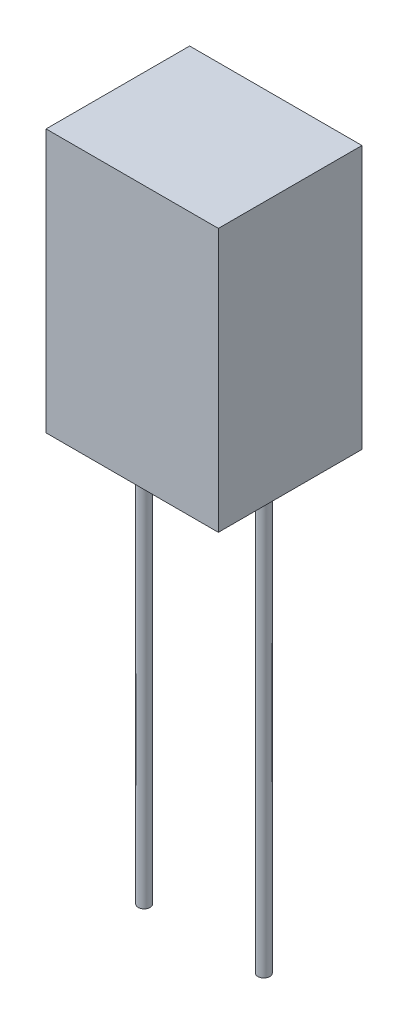
ISO-10303-21;
HEADER;
FILE_DESCRIPTION(('STEP AP214'),'2;1');
FILE_NAME('part.step','',(''),(''),'','','');
FILE_SCHEMA(('AUTOMOTIVE_DESIGN { 1 0 10303 214 1 1 1 1 }'));
ENDSEC;
DATA;
#1=APPLICATION_CONTEXT('core data for automotive mechanical design processes');
#2=APPLICATION_PROTOCOL_DEFINITION('international standard','automotive_design',2000,#1);
#3=PRODUCT_CONTEXT('',#1,'mechanical');
#4=PRODUCT('Part','Part','',(#3));
#5=PRODUCT_RELATED_PRODUCT_CATEGORY('part','',(#4));
#6=PRODUCT_DEFINITION_FORMATION('','',#4);
#7=PRODUCT_DEFINITION_CONTEXT('part definition',#1,'design');
#8=PRODUCT_DEFINITION('design','',#6,#7);
#9=PRODUCT_DEFINITION_SHAPE('','',#8);
#10=(LENGTH_UNIT() NAMED_UNIT(*) SI_UNIT(.MILLI.,.METRE.));
#11=(NAMED_UNIT(*) PLANE_ANGLE_UNIT() SI_UNIT($,.RADIAN.));
#12=(NAMED_UNIT(*) SI_UNIT($,.STERADIAN.) SOLID_ANGLE_UNIT());
#13=UNCERTAINTY_MEASURE_WITH_UNIT(LENGTH_MEASURE(1.E-05),#10,'distance_accuracy_value','');
#14=(GEOMETRIC_REPRESENTATION_CONTEXT(3) GLOBAL_UNCERTAINTY_ASSIGNED_CONTEXT((#13)) GLOBAL_UNIT_ASSIGNED_CONTEXT((#10,
#11,#12)) REPRESENTATION_CONTEXT('',''));
#15=CARTESIAN_POINT('',(0.,0.,0.));
#16=DIRECTION('',(0.,0.,1.));
#17=DIRECTION('',(1.,0.,0.));
#18=AXIS2_PLACEMENT_3D('',#15,#16,#17);
#19=CARTESIAN_POINT('',(3.6,5.5,6.));
#20=DIRECTION('',(-1.,0.,0.));
#21=DIRECTION('',(0.,-1.,0.));
#22=AXIS2_PLACEMENT_3D('',#19,#20,#21);
#23=PLANE('',#22);
#24=DIRECTION('',(0.,1.,0.));
#25=VECTOR('',#24,1.);
#26=CARTESIAN_POINT('',(3.6,5.5,0.));
#27=LINE('',#26,#25);
#28=CARTESIAN_POINT('',(3.6,-5.5,0.));
#29=VERTEX_POINT('',#28);
#30=CARTESIAN_POINT('',(3.6,5.5,0.));
#31=VERTEX_POINT('',#30);
#32=EDGE_CURVE('E104',#29,#31,#27,.T.);
#33=ORIENTED_EDGE('',*,*,#32,.T.);
#34=DIRECTION('',(0.,0.,-1.));
#35=VECTOR('',#34,1.);
#36=CARTESIAN_POINT('',(3.6,5.5,6.));
#37=LINE('',#36,#35);
#38=CARTESIAN_POINT('',(3.6,5.5,6.));
#39=VERTEX_POINT('',#38);
#40=EDGE_CURVE('E95',#39,#31,#37,.T.);
#41=ORIENTED_EDGE('',*,*,#40,.F.);
#42=DIRECTION('',(0.,1.,0.));
#43=VECTOR('',#42,1.);
#44=CARTESIAN_POINT('',(3.6,5.5,6.));
#45=LINE('',#44,#43);
#46=CARTESIAN_POINT('',(3.6,-5.5,6.));
#47=VERTEX_POINT('',#46);
#48=EDGE_CURVE('E89',#47,#39,#45,.T.);
#49=ORIENTED_EDGE('',*,*,#48,.F.);
#50=DIRECTION('',(0.,0.,-1.));
#51=VECTOR('',#50,1.);
#52=CARTESIAN_POINT('',(3.6,-5.5,6.));
#53=LINE('',#52,#51);
#54=EDGE_CURVE('E100',#47,#29,#53,.T.);
#55=ORIENTED_EDGE('',*,*,#54,.T.);
#56=EDGE_LOOP('',(#33,#41,#49,#55));
#57=FACE_BOUND('',#56,.T.);
#58=ADVANCED_FACE('F37',(#57),#23,.F.);
#59=CARTESIAN_POINT('',(-3.6,5.5,6.));
#60=DIRECTION('',(0.,-1.,0.));
#61=DIRECTION('',(0.,0.,-1.));
#62=AXIS2_PLACEMENT_3D('',#59,#60,#61);
#63=PLANE('',#62);
#64=DIRECTION('',(-1.,0.,0.));
#65=VECTOR('',#64,1.);
#66=CARTESIAN_POINT('',(-3.6,5.5,0.));
#67=LINE('',#66,#65);
#68=CARTESIAN_POINT('',(-3.6,5.5,0.));
#69=VERTEX_POINT('',#68);
#70=EDGE_CURVE('E94',#31,#69,#67,.T.);
#71=ORIENTED_EDGE('',*,*,#70,.T.);
#72=DIRECTION('',(0.,0.,-1.));
#73=VECTOR('',#72,1.);
#74=CARTESIAN_POINT('',(-3.6,5.5,6.));
#75=LINE('',#74,#73);
#76=CARTESIAN_POINT('',(-3.6,5.5,6.));
#77=VERTEX_POINT('',#76);
#78=EDGE_CURVE('E92',#77,#69,#75,.T.);
#79=ORIENTED_EDGE('',*,*,#78,.F.);
#80=DIRECTION('',(-1.,0.,0.));
#81=VECTOR('',#80,1.);
#82=CARTESIAN_POINT('',(-3.6,5.5,6.));
#83=LINE('',#82,#81);
#84=EDGE_CURVE('E84',#39,#77,#83,.T.);
#85=ORIENTED_EDGE('',*,*,#84,.F.);
#86=ORIENTED_EDGE('',*,*,#40,.T.);
#87=EDGE_LOOP('',(#71,#79,#85,#86));
#88=FACE_BOUND('',#87,.T.);
#89=ADVANCED_FACE('F93',(#88),#63,.F.);
#90=CARTESIAN_POINT('',(-3.6,5.5,6.));
#91=DIRECTION('',(1.,0.,0.));
#92=DIRECTION('',(0.,1.,0.));
#93=AXIS2_PLACEMENT_3D('',#90,#91,#92);
#94=PLANE('',#93);
#95=DIRECTION('',(0.,-1.,0.));
#96=VECTOR('',#95,1.);
#97=CARTESIAN_POINT('',(-3.6,5.5,0.));
#98=LINE('',#97,#96);
#99=CARTESIAN_POINT('',(-3.6,-5.5,0.));
#100=VERTEX_POINT('',#99);
#101=EDGE_CURVE('E70',#69,#100,#98,.T.);
#102=ORIENTED_EDGE('',*,*,#101,.T.);
#103=DIRECTION('',(0.,0.,-1.));
#104=VECTOR('',#103,1.);
#105=CARTESIAN_POINT('',(-3.6,-5.5,6.));
#106=LINE('',#105,#104);
#107=CARTESIAN_POINT('',(-3.6,-5.5,6.));
#108=VERTEX_POINT('',#107);
#109=EDGE_CURVE('E96',#108,#100,#106,.T.);
#110=ORIENTED_EDGE('',*,*,#109,.F.);
#111=DIRECTION('',(0.,-1.,0.));
#112=VECTOR('',#111,1.);
#113=CARTESIAN_POINT('',(-3.6,5.5,6.));
#114=LINE('',#113,#112);
#115=EDGE_CURVE('E87',#77,#108,#114,.T.);
#116=ORIENTED_EDGE('',*,*,#115,.F.);
#117=ORIENTED_EDGE('',*,*,#78,.T.);
#118=EDGE_LOOP('',(#102,#110,#116,#117));
#119=FACE_BOUND('',#118,.T.);
#120=ADVANCED_FACE('F98',(#119),#94,.F.);
#121=CARTESIAN_POINT('',(-3.6,-5.5,6.));
#122=DIRECTION('',(0.,1.,0.));
#123=DIRECTION('',(0.,0.,1.));
#124=AXIS2_PLACEMENT_3D('',#121,#122,#123);
#125=PLANE('',#124);
#126=CARTESIAN_POINT('',(2.5,-5.5,3.));
#127=DIRECTION('',(0.,1.,0.));
#128=DIRECTION('',(0.,0.,1.));
#129=AXIS2_PLACEMENT_3D('',#126,#127,#128);
#130=CIRCLE('',#129,0.25);
#131=CARTESIAN_POINT('',(2.5,-5.5,3.25));
#132=VERTEX_POINT('',#131);
#133=EDGE_CURVE('E11',#132,#132,#130,.F.);
#134=ORIENTED_EDGE('',*,*,#133,.F.);
#135=EDGE_LOOP('',(#134));
#136=FACE_BOUND('',#135,.T.);
#137=CARTESIAN_POINT('',(-2.5,-5.5,3.));
#138=DIRECTION('',(0.,1.,0.));
#139=DIRECTION('',(0.,0.,1.));
#140=AXIS2_PLACEMENT_3D('',#137,#138,#139);
#141=CIRCLE('',#140,0.25);
#142=CARTESIAN_POINT('',(-2.5,-5.5,3.25));
#143=VERTEX_POINT('',#142);
#144=EDGE_CURVE('E45',#143,#143,#141,.F.);
#145=ORIENTED_EDGE('',*,*,#144,.F.);
#146=EDGE_LOOP('',(#145));
#147=FACE_BOUND('',#146,.T.);
#148=DIRECTION('',(1.,0.,0.));
#149=VECTOR('',#148,1.);
#150=CARTESIAN_POINT('',(-3.6,-5.5,0.));
#151=LINE('',#150,#149);
#152=EDGE_CURVE('E76',#100,#29,#151,.T.);
#153=ORIENTED_EDGE('',*,*,#152,.T.);
#154=ORIENTED_EDGE('',*,*,#54,.F.);
#155=DIRECTION('',(1.,0.,0.));
#156=VECTOR('',#155,1.);
#157=CARTESIAN_POINT('',(-3.6,-5.5,6.));
#158=LINE('',#157,#156);
#159=EDGE_CURVE('E53',#108,#47,#158,.T.);
#160=ORIENTED_EDGE('',*,*,#159,.F.);
#161=ORIENTED_EDGE('',*,*,#109,.T.);
#162=EDGE_LOOP('',(#153,#154,#160,#161));
#163=FACE_BOUND('',#162,.T.);
#164=ADVANCED_FACE('F118',(#136,#147,#163),#125,.F.);
#165=CARTESIAN_POINT('',(0.,0.,6.));
#166=DIRECTION('',(0.,0.,1.));
#167=DIRECTION('',(1.,0.,0.));
#168=AXIS2_PLACEMENT_3D('',#165,#166,#167);
#169=PLANE('',#168);
#170=ORIENTED_EDGE('',*,*,#48,.T.);
#171=ORIENTED_EDGE('',*,*,#84,.T.);
#172=ORIENTED_EDGE('',*,*,#115,.T.);
#173=ORIENTED_EDGE('',*,*,#159,.T.);
#174=EDGE_LOOP('',(#170,#171,#172,#173));
#175=FACE_BOUND('',#174,.T.);
#176=ADVANCED_FACE('F85',(#175),#169,.T.);
#177=CARTESIAN_POINT('',(0.,0.,0.));
#178=DIRECTION('',(0.,0.,1.));
#179=DIRECTION('',(1.,0.,0.));
#180=AXIS2_PLACEMENT_3D('',#177,#178,#179);
#181=PLANE('',#180);
#182=ORIENTED_EDGE('',*,*,#32,.F.);
#183=ORIENTED_EDGE('',*,*,#152,.F.);
#184=ORIENTED_EDGE('',*,*,#101,.F.);
#185=ORIENTED_EDGE('',*,*,#70,.F.);
#186=EDGE_LOOP('',(#182,#183,#184,#185));
#187=FACE_BOUND('',#186,.T.);
#188=ADVANCED_FACE('F126',(#187),#181,.F.);
#189=CARTESIAN_POINT('',(-2.5,-23.5,3.));
#190=DIRECTION('',(0.,1.,0.));
#191=DIRECTION('',(0.,0.,1.));
#192=AXIS2_PLACEMENT_3D('',#189,#190,#191);
#193=CYLINDRICAL_SURFACE('',#192,0.25);
#194=CARTESIAN_POINT('',(-2.5,-23.5,3.));
#195=DIRECTION('',(0.,-1.,0.));
#196=DIRECTION('',(0.,0.,-1.));
#197=AXIS2_PLACEMENT_3D('',#194,#195,#196);
#198=CIRCLE('',#197,0.25);
#199=CARTESIAN_POINT('',(-2.5,-23.5,2.75));
#200=VERTEX_POINT('',#199);
#201=EDGE_CURVE('E107',#200,#200,#198,.T.);
#202=ORIENTED_EDGE('',*,*,#201,.F.);
#203=EDGE_LOOP('',(#202));
#204=FACE_BOUND('',#203,.T.);
#205=ORIENTED_EDGE('',*,*,#144,.T.);
#206=EDGE_LOOP('',(#205));
#207=FACE_BOUND('',#206,.T.);
#208=ADVANCED_FACE('F116',(#204,#207),#193,.T.);
#209=CARTESIAN_POINT('',(-2.5,-23.5,3.));
#210=DIRECTION('',(0.,-1.,0.));
#211=DIRECTION('',(0.,0.,-1.));
#212=AXIS2_PLACEMENT_3D('',#209,#210,#211);
#213=PLANE('',#212);
#214=ORIENTED_EDGE('',*,*,#201,.T.);
#215=EDGE_LOOP('',(#214));
#216=FACE_BOUND('',#215,.T.);
#217=ADVANCED_FACE('F142',(#216),#213,.T.);
#218=CARTESIAN_POINT('',(2.5,-23.5,3.));
#219=DIRECTION('',(0.,1.,0.));
#220=DIRECTION('',(0.,0.,1.));
#221=AXIS2_PLACEMENT_3D('',#218,#219,#220);
#222=CYLINDRICAL_SURFACE('',#221,0.25);
#223=CARTESIAN_POINT('',(2.5,-23.5,3.));
#224=DIRECTION('',(0.,-1.,0.));
#225=DIRECTION('',(0.,0.,-1.));
#226=AXIS2_PLACEMENT_3D('',#223,#224,#225);
#227=CIRCLE('',#226,0.25);
#228=CARTESIAN_POINT('',(2.5,-23.5,2.75));
#229=VERTEX_POINT('',#228);
#230=EDGE_CURVE('E161',#229,#229,#227,.T.);
#231=ORIENTED_EDGE('',*,*,#230,.F.);
#232=EDGE_LOOP('',(#231));
#233=FACE_BOUND('',#232,.T.);
#234=ORIENTED_EDGE('',*,*,#133,.T.);
#235=EDGE_LOOP('',(#234));
#236=FACE_BOUND('',#235,.T.);
#237=ADVANCED_FACE('F148',(#233,#236),#222,.T.);
#238=CARTESIAN_POINT('',(2.5,-23.5,3.));
#239=DIRECTION('',(0.,-1.,0.));
#240=DIRECTION('',(0.,0.,-1.));
#241=AXIS2_PLACEMENT_3D('',#238,#239,#240);
#242=PLANE('',#241);
#243=ORIENTED_EDGE('',*,*,#230,.T.);
#244=EDGE_LOOP('',(#243));
#245=FACE_BOUND('',#244,.T.);
#246=ADVANCED_FACE('F150',(#245),#242,.T.);
#247=CLOSED_SHELL('',(#58,#89,#120,#164,#176,#188,#208,#217,#237,#246));
#248=MANIFOLD_SOLID_BREP('B2',#247);
#249=ADVANCED_BREP_SHAPE_REPRESENTATION('',(#18,#248),#14);
#250=SHAPE_DEFINITION_REPRESENTATION(#9,#249);
ENDSEC;
END-ISO-10303-21;
